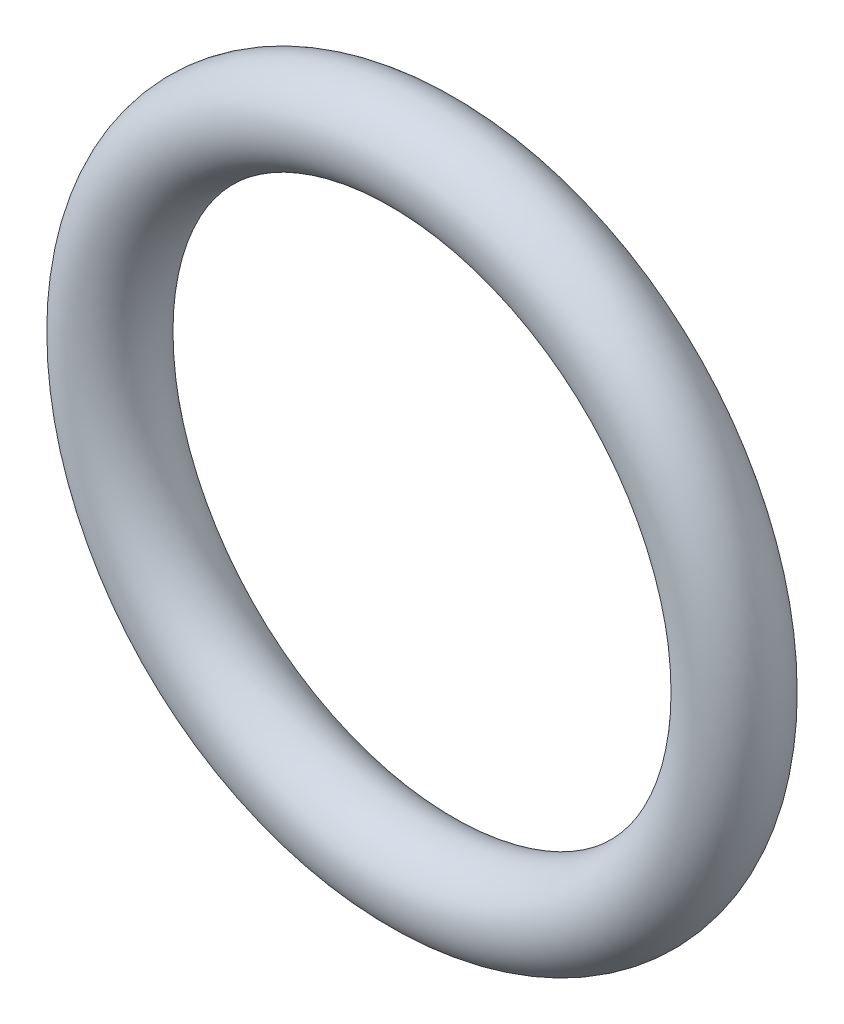
ISO-10303-21;
HEADER;
FILE_DESCRIPTION(('STEP AP214'),'2;1');
FILE_NAME('part.step','',(''),(''),'','','');
FILE_SCHEMA(('AUTOMOTIVE_DESIGN { 1 0 10303 214 1 1 1 1 }'));
ENDSEC;
DATA;
#1=APPLICATION_CONTEXT('core data for automotive mechanical design processes');
#2=APPLICATION_PROTOCOL_DEFINITION('international standard','automotive_design',2000,#1);
#3=PRODUCT_CONTEXT('',#1,'mechanical');
#4=PRODUCT('Part','Part','',(#3));
#5=PRODUCT_RELATED_PRODUCT_CATEGORY('part','',(#4));
#6=PRODUCT_DEFINITION_FORMATION('','',#4);
#7=PRODUCT_DEFINITION_CONTEXT('part definition',#1,'design');
#8=PRODUCT_DEFINITION('design','',#6,#7);
#9=PRODUCT_DEFINITION_SHAPE('','',#8);
#10=(LENGTH_UNIT() NAMED_UNIT(*) SI_UNIT(.MILLI.,.METRE.));
#11=(NAMED_UNIT(*) PLANE_ANGLE_UNIT() SI_UNIT($,.RADIAN.));
#12=(NAMED_UNIT(*) SI_UNIT($,.STERADIAN.) SOLID_ANGLE_UNIT());
#13=UNCERTAINTY_MEASURE_WITH_UNIT(LENGTH_MEASURE(1.E-05),#10,'distance_accuracy_value','');
#14=(GEOMETRIC_REPRESENTATION_CONTEXT(3) GLOBAL_UNCERTAINTY_ASSIGNED_CONTEXT((#13)) GLOBAL_UNIT_ASSIGNED_CONTEXT((#10,
#11,#12)) REPRESENTATION_CONTEXT('',''));
#15=CARTESIAN_POINT('',(0.,0.,0.));
#16=DIRECTION('',(0.,0.,1.));
#17=DIRECTION('',(1.,0.,0.));
#18=AXIS2_PLACEMENT_3D('',#15,#16,#17);
#19=CARTESIAN_POINT('',(0.,0.,0.));
#20=DIRECTION('',(0.,0.,1.));
#21=DIRECTION('',(1.,0.,0.));
#22=AXIS2_PLACEMENT_3D('',#19,#20,#21);
#23=TOROIDAL_SURFACE('',#22,9.335,1.335);
#24=CARTESIAN_POINT('',(10.67,0.,0.));
#25=VERTEX_POINT('',#24);
#26=VERTEX_LOOP('',#25);
#27=FACE_BOUND('',#26,.T.);
#28=ADVANCED_FACE('F37',(#27),#23,.T.);
#29=CLOSED_SHELL('',(#28));
#30=MANIFOLD_SOLID_BREP('B2',#29);
#31=ADVANCED_BREP_SHAPE_REPRESENTATION('',(#18,#30),#14);
#32=SHAPE_DEFINITION_REPRESENTATION(#9,#31);
ENDSEC;
END-ISO-10303-21;
